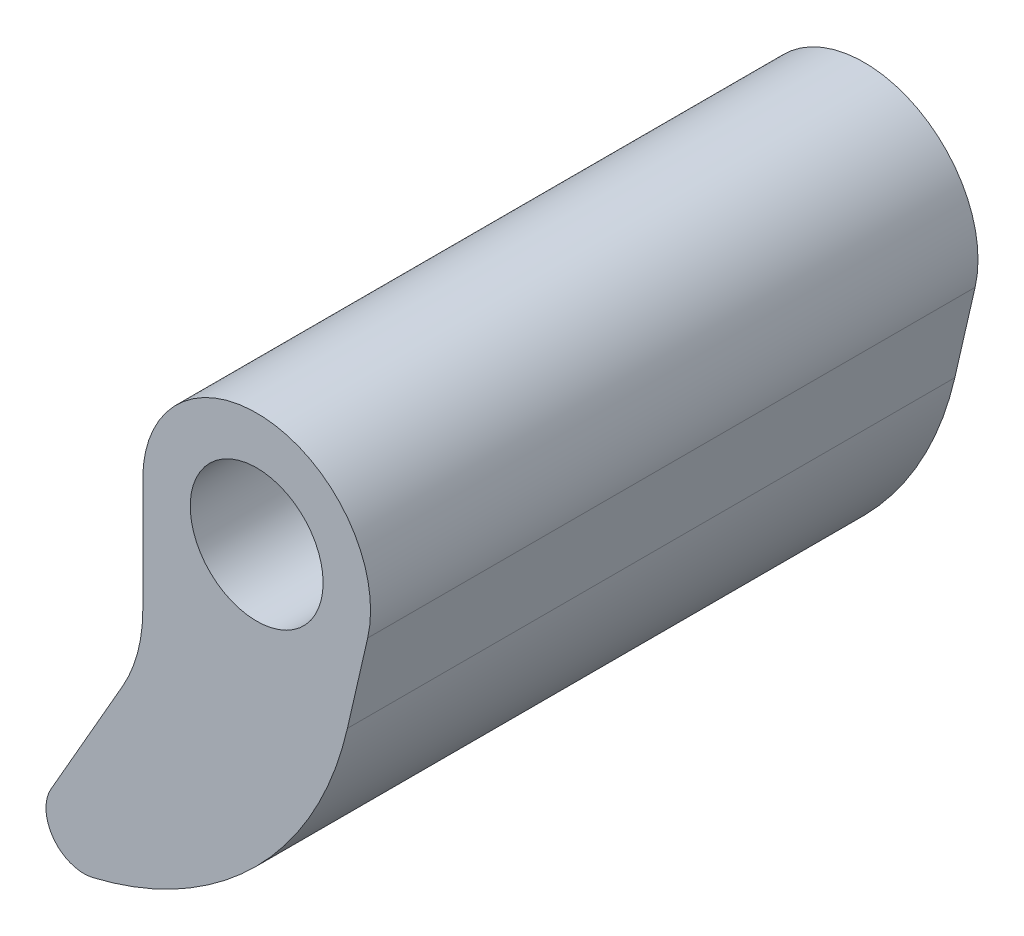
ISO-10303-21;
HEADER;
FILE_DESCRIPTION(('STEP AP214'),'2;1');
FILE_NAME('part.step','',(''),(''),'','','');
FILE_SCHEMA(('AUTOMOTIVE_DESIGN { 1 0 10303 214 1 1 1 1 }'));
ENDSEC;
DATA;
#1=APPLICATION_CONTEXT('core data for automotive mechanical design processes');
#2=APPLICATION_PROTOCOL_DEFINITION('international standard','automotive_design',2000,#1);
#3=PRODUCT_CONTEXT('',#1,'mechanical');
#4=PRODUCT('Part','Part','',(#3));
#5=PRODUCT_RELATED_PRODUCT_CATEGORY('part','',(#4));
#6=PRODUCT_DEFINITION_FORMATION('','',#4);
#7=PRODUCT_DEFINITION_CONTEXT('part definition',#1,'design');
#8=PRODUCT_DEFINITION('design','',#6,#7);
#9=PRODUCT_DEFINITION_SHAPE('','',#8);
#10=(LENGTH_UNIT() NAMED_UNIT(*) SI_UNIT(.MILLI.,.METRE.));
#11=(NAMED_UNIT(*) PLANE_ANGLE_UNIT() SI_UNIT($,.RADIAN.));
#12=(NAMED_UNIT(*) SI_UNIT($,.STERADIAN.) SOLID_ANGLE_UNIT());
#13=UNCERTAINTY_MEASURE_WITH_UNIT(LENGTH_MEASURE(1.E-05),#10,'distance_accuracy_value','');
#14=(GEOMETRIC_REPRESENTATION_CONTEXT(3) GLOBAL_UNCERTAINTY_ASSIGNED_CONTEXT((#13)) GLOBAL_UNIT_ASSIGNED_CONTEXT((#10,
#11,#12)) REPRESENTATION_CONTEXT('',''));
#15=CARTESIAN_POINT('',(0.,0.,0.));
#16=DIRECTION('',(0.,0.,1.));
#17=DIRECTION('',(1.,0.,0.));
#18=AXIS2_PLACEMENT_3D('',#15,#16,#17);
#19=CARTESIAN_POINT('',(0.,0.,8.00000000000008));
#20=DIRECTION('',(0.,0.,1.));
#21=DIRECTION('',(1.,0.,0.));
#22=AXIS2_PLACEMENT_3D('',#19,#20,#21);
#23=PLANE('',#22);
#24=CARTESIAN_POINT('',(0.,0.,8.00000000000008));
#25=DIRECTION('',(0.,0.,1.));
#26=DIRECTION('',(1.,0.,0.));
#27=AXIS2_PLACEMENT_3D('',#24,#25,#26);
#28=CIRCLE('',#27,1.5);
#29=CARTESIAN_POINT('',(1.46196270821361,-0.3356561332567,8.00000000000006));
#30=VERTEX_POINT('',#29);
#31=CARTESIAN_POINT('',(-1.50000000000001,0.,8.00000000000007));
#32=VERTEX_POINT('',#31);
#33=EDGE_CURVE('E136',#30,#32,#28,.T.);
#34=ORIENTED_EDGE('',*,*,#33,.T.);
#35=DIRECTION('',(0.,-1.,0.));
#36=VECTOR('',#35,1.);
#37=CARTESIAN_POINT('',(-1.50000000000001,-1.5,8.00000000000008));
#38=LINE('',#37,#36);
#39=CARTESIAN_POINT('',(-1.50000000000001,-1.5,8.00000000000008));
#40=VERTEX_POINT('',#39);
#41=EDGE_CURVE('E89',#32,#40,#38,.T.);
#42=ORIENTED_EDGE('',*,*,#41,.T.);
#43=CARTESIAN_POINT('',(-3.51021488002263,-1.5,8.00000000000009));
#44=DIRECTION('',(0.,0.,-1.));
#45=DIRECTION('',(-1.,0.,0.));
#46=AXIS2_PLACEMENT_3D('',#43,#44,#45);
#47=CIRCLE('',#46,2.01021488002263);
#48=CARTESIAN_POINT('',(-1.76637891759258,-2.5,8.00000000000009));
#49=VERTEX_POINT('',#48);
#50=EDGE_CURVE('E148',#40,#49,#47,.T.);
#51=ORIENTED_EDGE('',*,*,#50,.T.);
#52=DIRECTION('',(-0.497459256688394,-0.867487341656941,0.));
#53=VECTOR('',#52,1.);
#54=CARTESIAN_POINT('',(-1.76637891759258,-2.5,8.00000000000009));
#55=LINE('',#54,#53);
#56=CARTESIAN_POINT('',(-2.70858955675086,-4.14306079674844,8.00000000000007));
#57=VERTEX_POINT('',#56);
#58=EDGE_CURVE('E105',#49,#57,#55,.T.);
#59=ORIENTED_EDGE('',*,*,#58,.T.);
#60=CARTESIAN_POINT('',(-2.27484588592239,-4.39179042509264,8.00000000000009));
#61=DIRECTION('',(0.,0.,1.));
#62=DIRECTION('',(-1.,0.,0.));
#63=AXIS2_PLACEMENT_3D('',#60,#61,#62);
#64=CIRCLE('',#63,0.499999999999999);
#65=CARTESIAN_POINT('',(-2.15946058218553,-4.87829451724557,8.00000000000008));
#66=VERTEX_POINT('',#65);
#67=EDGE_CURVE('E99',#57,#66,#64,.T.);
#68=ORIENTED_EDGE('',*,*,#67,.T.);
#69=CARTESIAN_POINT('',(-3.20000000000002,-0.491022755430205,8.00000000000006));
#70=DIRECTION('',(0.,0.,1.));
#71=DIRECTION('',(-1.,0.,0.));
#72=AXIS2_PLACEMENT_3D('',#69,#70,#71);
#73=CIRCLE('',#72,4.50897724456979);
#74=CARTESIAN_POINT('',(1.19463772249644,-1.5,8.00000000000007));
#75=VERTEX_POINT('',#74);
#76=EDGE_CURVE('E103',#66,#75,#73,.T.);
#77=ORIENTED_EDGE('',*,*,#76,.T.);
#78=DIRECTION('',(0.22377075550446,0.974641805475716,0.));
#79=VECTOR('',#78,1.);
#80=CARTESIAN_POINT('',(1.46196270821361,-0.3356561332567,8.00000000000006));
#81=LINE('',#80,#79);
#82=EDGE_CURVE('E49',#75,#30,#81,.T.);
#83=ORIENTED_EDGE('',*,*,#82,.T.);
#84=EDGE_LOOP('',(#34,#42,#51,#59,#68,#77,#83));
#85=FACE_BOUND('',#84,.T.);
#86=CARTESIAN_POINT('',(0.,0.,8.00000000000008));
#87=DIRECTION('',(0.,0.,1.));
#88=DIRECTION('',(1.,0.,0.));
#89=AXIS2_PLACEMENT_3D('',#86,#87,#88);
#90=CIRCLE('',#89,0.875);
#91=CARTESIAN_POINT('',(0.875000000000009,0.,8.00000000000008));
#92=VERTEX_POINT('',#91);
#93=EDGE_CURVE('E127',#92,#92,#90,.T.);
#94=ORIENTED_EDGE('',*,*,#93,.F.);
#95=EDGE_LOOP('',(#94));
#96=FACE_BOUND('',#95,.T.);
#97=ADVANCED_FACE('F32',(#85,#96),#23,.T.);
#98=CARTESIAN_POINT('',(0.,0.,0.));
#99=DIRECTION('',(0.,0.,1.));
#100=DIRECTION('',(1.,0.,0.));
#101=AXIS2_PLACEMENT_3D('',#98,#99,#100);
#102=PLANE('',#101);
#103=CARTESIAN_POINT('',(0.,0.,0.));
#104=DIRECTION('',(0.,0.,1.));
#105=DIRECTION('',(1.,0.,0.));
#106=AXIS2_PLACEMENT_3D('',#103,#104,#105);
#107=CIRCLE('',#106,1.5);
#108=CARTESIAN_POINT('',(1.4619627082136,-0.3356561332567,0.));
#109=VERTEX_POINT('',#108);
#110=CARTESIAN_POINT('',(-1.50000000000001,0.,0.));
#111=VERTEX_POINT('',#110);
#112=EDGE_CURVE('E123',#109,#111,#107,.T.);
#113=ORIENTED_EDGE('',*,*,#112,.F.);
#114=DIRECTION('',(0.22377075550446,0.974641805475716,0.));
#115=VECTOR('',#114,1.);
#116=CARTESIAN_POINT('',(1.4619627082136,-0.3356561332567,0.));
#117=LINE('',#116,#115);
#118=CARTESIAN_POINT('',(1.19463772249643,-1.50000000000001,0.));
#119=VERTEX_POINT('',#118);
#120=EDGE_CURVE('E81',#119,#109,#117,.T.);
#121=ORIENTED_EDGE('',*,*,#120,.F.);
#122=CARTESIAN_POINT('',(-3.20000000000001,-0.491022755430194,0.));
#123=DIRECTION('',(0.,0.,1.));
#124=DIRECTION('',(-1.,0.,0.));
#125=AXIS2_PLACEMENT_3D('',#122,#123,#124);
#126=CIRCLE('',#125,4.50897724456979);
#127=CARTESIAN_POINT('',(-2.15946058218553,-4.87829451724557,0.));
#128=VERTEX_POINT('',#127);
#129=EDGE_CURVE('E75',#128,#119,#126,.T.);
#130=ORIENTED_EDGE('',*,*,#129,.F.);
#131=CARTESIAN_POINT('',(-2.27484588592238,-4.39179042509264,0.));
#132=DIRECTION('',(0.,0.,1.));
#133=DIRECTION('',(-1.,0.,0.));
#134=AXIS2_PLACEMENT_3D('',#131,#132,#133);
#135=CIRCLE('',#134,0.499999999999999);
#136=CARTESIAN_POINT('',(-2.70858955675085,-4.14306079674844,0.));
#137=VERTEX_POINT('',#136);
#138=EDGE_CURVE('E113',#137,#128,#135,.T.);
#139=ORIENTED_EDGE('',*,*,#138,.F.);
#140=DIRECTION('',(-0.497459256688394,-0.867487341656941,0.));
#141=VECTOR('',#140,1.);
#142=CARTESIAN_POINT('',(-1.76637891759257,-2.5,0.));
#143=LINE('',#142,#141);
#144=CARTESIAN_POINT('',(-1.76637891759257,-2.5,0.));
#145=VERTEX_POINT('',#144);
#146=EDGE_CURVE('E131',#145,#137,#143,.T.);
#147=ORIENTED_EDGE('',*,*,#146,.F.);
#148=CARTESIAN_POINT('',(-3.51021488002263,-1.5,0.));
#149=DIRECTION('',(0.,0.,-1.));
#150=DIRECTION('',(-1.,0.,0.));
#151=AXIS2_PLACEMENT_3D('',#148,#149,#150);
#152=CIRCLE('',#151,2.01021488002263);
#153=CARTESIAN_POINT('',(-1.5,-1.5,0.));
#154=VERTEX_POINT('',#153);
#155=EDGE_CURVE('E129',#154,#145,#152,.T.);
#156=ORIENTED_EDGE('',*,*,#155,.F.);
#157=DIRECTION('',(0.,-1.,0.));
#158=VECTOR('',#157,1.);
#159=CARTESIAN_POINT('',(-1.5,-1.5,0.));
#160=LINE('',#159,#158);
#161=EDGE_CURVE('E126',#111,#154,#160,.T.);
#162=ORIENTED_EDGE('',*,*,#161,.F.);
#163=EDGE_LOOP('',(#113,#121,#130,#139,#147,#156,#162));
#164=FACE_BOUND('',#163,.T.);
#165=CARTESIAN_POINT('',(0.,0.,0.));
#166=DIRECTION('',(0.,0.,1.));
#167=DIRECTION('',(1.,0.,0.));
#168=AXIS2_PLACEMENT_3D('',#165,#166,#167);
#169=CIRCLE('',#168,0.875);
#170=CARTESIAN_POINT('',(0.875,0.,0.));
#171=VERTEX_POINT('',#170);
#172=EDGE_CURVE('E160',#171,#171,#169,.T.);
#173=ORIENTED_EDGE('',*,*,#172,.T.);
#174=EDGE_LOOP('',(#173));
#175=FACE_BOUND('',#174,.T.);
#176=ADVANCED_FACE('F152',(#164,#175),#102,.F.);
#177=CARTESIAN_POINT('',(0.,0.,8.00000000000008));
#178=DIRECTION('',(0.,0.,-1.));
#179=DIRECTION('',(-1.,0.,0.));
#180=AXIS2_PLACEMENT_3D('',#177,#178,#179);
#181=CYLINDRICAL_SURFACE('',#180,1.5);
#182=ORIENTED_EDGE('',*,*,#112,.T.);
#183=DIRECTION('',(0.,0.,-1.));
#184=VECTOR('',#183,1.);
#185=CARTESIAN_POINT('',(-1.50000000000001,0.,8.00000000000007));
#186=LINE('',#185,#184);
#187=EDGE_CURVE('E11',#32,#111,#186,.T.);
#188=ORIENTED_EDGE('',*,*,#187,.F.);
#189=ORIENTED_EDGE('',*,*,#33,.F.);
#190=DIRECTION('',(0.,0.,-1.));
#191=VECTOR('',#190,1.);
#192=CARTESIAN_POINT('',(1.46196270821361,-0.3356561332567,8.00000000000006));
#193=LINE('',#192,#191);
#194=EDGE_CURVE('E119',#30,#109,#193,.T.);
#195=ORIENTED_EDGE('',*,*,#194,.T.);
#196=EDGE_LOOP('',(#182,#188,#189,#195));
#197=FACE_BOUND('',#196,.T.);
#198=ADVANCED_FACE('F34',(#197),#181,.T.);
#199=CARTESIAN_POINT('',(-1.50000000000001,-1.5,8.00000000000008));
#200=DIRECTION('',(1.,0.,0.));
#201=DIRECTION('',(0.,1.,0.));
#202=AXIS2_PLACEMENT_3D('',#199,#200,#201);
#203=PLANE('',#202);
#204=ORIENTED_EDGE('',*,*,#161,.T.);
#205=DIRECTION('',(0.,0.,-1.));
#206=VECTOR('',#205,1.);
#207=CARTESIAN_POINT('',(-1.50000000000001,-1.5,8.00000000000008));
#208=LINE('',#207,#206);
#209=EDGE_CURVE('E41',#40,#154,#208,.T.);
#210=ORIENTED_EDGE('',*,*,#209,.F.);
#211=ORIENTED_EDGE('',*,*,#41,.F.);
#212=ORIENTED_EDGE('',*,*,#187,.T.);
#213=EDGE_LOOP('',(#204,#210,#211,#212));
#214=FACE_BOUND('',#213,.T.);
#215=ADVANCED_FACE('F186',(#214),#203,.F.);
#216=CARTESIAN_POINT('',(-3.51021488002263,-1.5,8.00000000000009));
#217=DIRECTION('',(0.,0.,-1.));
#218=DIRECTION('',(-1.,0.,0.));
#219=AXIS2_PLACEMENT_3D('',#216,#217,#218);
#220=CYLINDRICAL_SURFACE('',#219,2.01021488002263);
#221=ORIENTED_EDGE('',*,*,#155,.T.);
#222=DIRECTION('',(0.,0.,-1.));
#223=VECTOR('',#222,1.);
#224=CARTESIAN_POINT('',(-1.76637891759258,-2.5,8.00000000000009));
#225=LINE('',#224,#223);
#226=EDGE_CURVE('E140',#49,#145,#225,.T.);
#227=ORIENTED_EDGE('',*,*,#226,.F.);
#228=ORIENTED_EDGE('',*,*,#50,.F.);
#229=ORIENTED_EDGE('',*,*,#209,.T.);
#230=EDGE_LOOP('',(#221,#227,#228,#229));
#231=FACE_BOUND('',#230,.T.);
#232=ADVANCED_FACE('F146',(#231),#220,.F.);
#233=CARTESIAN_POINT('',(-1.76637891759258,-2.5,8.00000000000009));
#234=DIRECTION('',(0.867487341656954,-0.497459256688392,0.));
#235=DIRECTION('',(0.497459256688395,0.867487341656942,0.));
#236=AXIS2_PLACEMENT_3D('',#233,#234,#235);
#237=PLANE('',#236);
#238=ORIENTED_EDGE('',*,*,#146,.T.);
#239=DIRECTION('',(0.,0.,-1.));
#240=VECTOR('',#239,1.);
#241=CARTESIAN_POINT('',(-2.70858955675086,-4.14306079674844,8.00000000000007));
#242=LINE('',#241,#240);
#243=EDGE_CURVE('E114',#57,#137,#242,.T.);
#244=ORIENTED_EDGE('',*,*,#243,.F.);
#245=ORIENTED_EDGE('',*,*,#58,.F.);
#246=ORIENTED_EDGE('',*,*,#226,.T.);
#247=EDGE_LOOP('',(#238,#244,#245,#246));
#248=FACE_BOUND('',#247,.T.);
#249=ADVANCED_FACE('F155',(#248),#237,.F.);
#250=CARTESIAN_POINT('',(-2.27484588592239,-4.39179042509264,8.00000000000009));
#251=DIRECTION('',(0.,0.,-1.));
#252=DIRECTION('',(-1.,0.,0.));
#253=AXIS2_PLACEMENT_3D('',#250,#251,#252);
#254=CYLINDRICAL_SURFACE('',#253,0.499999999999999);
#255=ORIENTED_EDGE('',*,*,#138,.T.);
#256=DIRECTION('',(0.,0.,-1.));
#257=VECTOR('',#256,1.);
#258=CARTESIAN_POINT('',(-2.15946058218553,-4.87829451724557,8.00000000000008));
#259=LINE('',#258,#257);
#260=EDGE_CURVE('E110',#66,#128,#259,.T.);
#261=ORIENTED_EDGE('',*,*,#260,.F.);
#262=ORIENTED_EDGE('',*,*,#67,.F.);
#263=ORIENTED_EDGE('',*,*,#243,.T.);
#264=EDGE_LOOP('',(#255,#261,#262,#263));
#265=FACE_BOUND('',#264,.T.);
#266=ADVANCED_FACE('F111',(#265),#254,.T.);
#267=CARTESIAN_POINT('',(-3.20000000000002,-0.491022755430205,8.00000000000006));
#268=DIRECTION('',(0.,0.,-1.));
#269=DIRECTION('',(-1.,0.,0.));
#270=AXIS2_PLACEMENT_3D('',#267,#268,#269);
#271=CYLINDRICAL_SURFACE('',#270,4.50897724456979);
#272=ORIENTED_EDGE('',*,*,#129,.T.);
#273=DIRECTION('',(0.,0.,-1.));
#274=VECTOR('',#273,1.);
#275=CARTESIAN_POINT('',(1.19463772249644,-1.5,8.00000000000007));
#276=LINE('',#275,#274);
#277=EDGE_CURVE('E115',#75,#119,#276,.T.);
#278=ORIENTED_EDGE('',*,*,#277,.F.);
#279=ORIENTED_EDGE('',*,*,#76,.F.);
#280=ORIENTED_EDGE('',*,*,#260,.T.);
#281=EDGE_LOOP('',(#272,#278,#279,#280));
#282=FACE_BOUND('',#281,.T.);
#283=ADVANCED_FACE('F117',(#282),#271,.T.);
#284=CARTESIAN_POINT('',(1.46196270821361,-0.3356561332567,8.00000000000006));
#285=DIRECTION('',(-0.974641805475724,0.22377075550446,0.));
#286=DIRECTION('',(-0.22377075550446,-0.974641805475716,0.));
#287=AXIS2_PLACEMENT_3D('',#284,#285,#286);
#288=PLANE('',#287);
#289=ORIENTED_EDGE('',*,*,#120,.T.);
#290=ORIENTED_EDGE('',*,*,#194,.F.);
#291=ORIENTED_EDGE('',*,*,#82,.F.);
#292=ORIENTED_EDGE('',*,*,#277,.T.);
#293=EDGE_LOOP('',(#289,#290,#291,#292));
#294=FACE_BOUND('',#293,.T.);
#295=ADVANCED_FACE('F176',(#294),#288,.F.);
#296=CARTESIAN_POINT('',(0.,0.,8.00000000000008));
#297=DIRECTION('',(0.,0.,-1.));
#298=DIRECTION('',(-1.,0.,0.));
#299=AXIS2_PLACEMENT_3D('',#296,#297,#298);
#300=CYLINDRICAL_SURFACE('',#299,0.875);
#301=ORIENTED_EDGE('',*,*,#93,.T.);
#302=EDGE_LOOP('',(#301));
#303=FACE_BOUND('',#302,.T.);
#304=ORIENTED_EDGE('',*,*,#172,.F.);
#305=EDGE_LOOP('',(#304));
#306=FACE_BOUND('',#305,.T.);
#307=ADVANCED_FACE('F166',(#303,#306),#300,.F.);
#308=CLOSED_SHELL('',(#97,#176,#198,#215,#232,#249,#266,#283,#295,#307));
#309=MANIFOLD_SOLID_BREP('B2',#308);
#310=ADVANCED_BREP_SHAPE_REPRESENTATION('',(#18,#309),#14);
#311=SHAPE_DEFINITION_REPRESENTATION(#9,#310);
ENDSEC;
END-ISO-10303-21;
